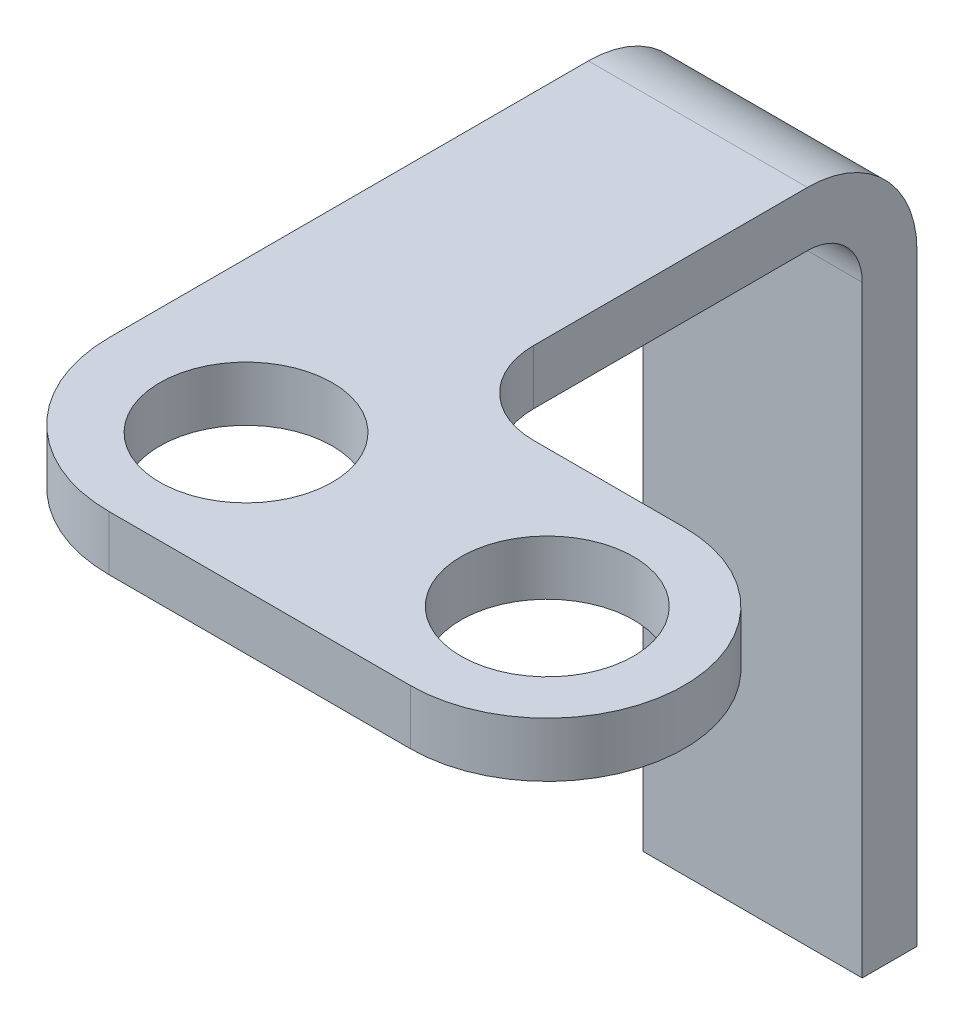
ISO-10303-21;
HEADER;
FILE_DESCRIPTION(('STEP AP214'),'2;1');
FILE_NAME('part.step','',(''),(''),'','','');
FILE_SCHEMA(('AUTOMOTIVE_DESIGN { 1 0 10303 214 1 1 1 1 }'));
ENDSEC;
DATA;
#1=APPLICATION_CONTEXT('core data for automotive mechanical design processes');
#2=APPLICATION_PROTOCOL_DEFINITION('international standard','automotive_design',2000,#1);
#3=PRODUCT_CONTEXT('',#1,'mechanical');
#4=PRODUCT('Part','Part','',(#3));
#5=PRODUCT_RELATED_PRODUCT_CATEGORY('part','',(#4));
#6=PRODUCT_DEFINITION_FORMATION('','',#4);
#7=PRODUCT_DEFINITION_CONTEXT('part definition',#1,'design');
#8=PRODUCT_DEFINITION('design','',#6,#7);
#9=PRODUCT_DEFINITION_SHAPE('','',#8);
#10=(LENGTH_UNIT() NAMED_UNIT(*) SI_UNIT(.MILLI.,.METRE.));
#11=(NAMED_UNIT(*) PLANE_ANGLE_UNIT() SI_UNIT($,.RADIAN.));
#12=(NAMED_UNIT(*) SI_UNIT($,.STERADIAN.) SOLID_ANGLE_UNIT());
#13=UNCERTAINTY_MEASURE_WITH_UNIT(LENGTH_MEASURE(1.E-05),#10,'distance_accuracy_value','');
#14=(GEOMETRIC_REPRESENTATION_CONTEXT(3) GLOBAL_UNCERTAINTY_ASSIGNED_CONTEXT((#13)) GLOBAL_UNIT_ASSIGNED_CONTEXT((#10,
#11,#12)) REPRESENTATION_CONTEXT('',''));
#15=CARTESIAN_POINT('',(0.,0.,0.));
#16=DIRECTION('',(0.,0.,1.));
#17=DIRECTION('',(1.,0.,0.));
#18=AXIS2_PLACEMENT_3D('',#15,#16,#17);
#19=CARTESIAN_POINT('',(8.,-3.,3.));
#20=DIRECTION('',(1.,0.,0.));
#21=DIRECTION('',(0.,0.,-1.));
#22=AXIS2_PLACEMENT_3D('',#19,#20,#21);
#23=PLANE('',#22);
#24=DIRECTION('',(0.,0.,1.));
#25=VECTOR('',#24,1.);
#26=CARTESIAN_POINT('',(8.,1.,3.00000000000002));
#27=LINE('',#26,#25);
#28=CARTESIAN_POINT('',(8.,1.,3.00000000000002));
#29=VERTEX_POINT('',#28);
#30=CARTESIAN_POINT('',(8.,0.999999999999999,13.));
#31=VERTEX_POINT('',#30);
#32=EDGE_CURVE('E139',#29,#31,#27,.T.);
#33=ORIENTED_EDGE('',*,*,#32,.T.);
#34=DIRECTION('',(0.,1.,0.));
#35=VECTOR('',#34,1.);
#36=CARTESIAN_POINT('',(8.,-1.,13.));
#37=LINE('',#36,#35);
#38=CARTESIAN_POINT('',(8.,-1.,13.));
#39=VERTEX_POINT('',#38);
#40=EDGE_CURVE('E127',#39,#31,#37,.T.);
#41=ORIENTED_EDGE('',*,*,#40,.F.);
#42=DIRECTION('',(0.,0.,1.));
#43=VECTOR('',#42,1.);
#44=CARTESIAN_POINT('',(8.,-1.,3.00000000000002));
#45=LINE('',#44,#43);
#46=CARTESIAN_POINT('',(8.,-1.,3.00000000000002));
#47=VERTEX_POINT('',#46);
#48=EDGE_CURVE('E207',#47,#39,#45,.T.);
#49=ORIENTED_EDGE('',*,*,#48,.F.);
#50=CARTESIAN_POINT('',(8.,-3.,3.));
#51=DIRECTION('',(1.,0.,0.));
#52=DIRECTION('',(0.,0.,-1.));
#53=AXIS2_PLACEMENT_3D('',#50,#51,#52);
#54=CIRCLE('',#53,2.);
#55=CARTESIAN_POINT('',(8.,-3.00000000000001,1.));
#56=VERTEX_POINT('',#55);
#57=EDGE_CURVE('E117',#56,#47,#54,.T.);
#58=ORIENTED_EDGE('',*,*,#57,.F.);
#59=DIRECTION('',(0.,1.,0.));
#60=VECTOR('',#59,1.);
#61=CARTESIAN_POINT('',(8.,-25.,1.));
#62=LINE('',#61,#60);
#63=CARTESIAN_POINT('',(8.,-25.,1.));
#64=VERTEX_POINT('',#63);
#65=EDGE_CURVE('E115',#64,#56,#62,.T.);
#66=ORIENTED_EDGE('',*,*,#65,.F.);
#67=DIRECTION('',(0.,0.,1.));
#68=VECTOR('',#67,1.);
#69=CARTESIAN_POINT('',(8.,-25.,-1.));
#70=LINE('',#69,#68);
#71=CARTESIAN_POINT('',(8.,-25.,-1.));
#72=VERTEX_POINT('',#71);
#73=EDGE_CURVE('E103',#72,#64,#70,.T.);
#74=ORIENTED_EDGE('',*,*,#73,.F.);
#75=DIRECTION('',(0.,1.,0.));
#76=VECTOR('',#75,1.);
#77=CARTESIAN_POINT('',(8.,-25.,-1.));
#78=LINE('',#77,#76);
#79=CARTESIAN_POINT('',(8.,-3.00000000000003,-1.));
#80=VERTEX_POINT('',#79);
#81=EDGE_CURVE('E109',#72,#80,#78,.T.);
#82=ORIENTED_EDGE('',*,*,#81,.T.);
#83=CARTESIAN_POINT('',(8.,-3.,3.));
#84=DIRECTION('',(1.,0.,0.));
#85=DIRECTION('',(0.,0.,-1.));
#86=AXIS2_PLACEMENT_3D('',#83,#84,#85);
#87=CIRCLE('',#86,4.);
#88=EDGE_CURVE('E50',#80,#29,#87,.T.);
#89=ORIENTED_EDGE('',*,*,#88,.T.);
#90=EDGE_LOOP('',(#33,#41,#49,#58,#66,#74,#82,#89));
#91=FACE_BOUND('',#90,.T.);
#92=ADVANCED_FACE('F33',(#91),#23,.T.);
#93=CARTESIAN_POINT('',(8.,1.,3.00000000000002));
#94=DIRECTION('',(0.,-1.,0.));
#95=DIRECTION('',(0.,0.,-1.));
#96=AXIS2_PLACEMENT_3D('',#93,#94,#95);
#97=PLANE('',#96);
#98=DIRECTION('',(-1.,0.,0.));
#99=VECTOR('',#98,1.);
#100=CARTESIAN_POINT('',(8.,1.,3.00000000000002));
#101=LINE('',#100,#99);
#102=CARTESIAN_POINT('',(0.,1.,3.00000000000002));
#103=VERTEX_POINT('',#102);
#104=EDGE_CURVE('E122',#29,#103,#101,.T.);
#105=ORIENTED_EDGE('',*,*,#104,.T.);
#106=DIRECTION('',(0.,0.,1.));
#107=VECTOR('',#106,1.);
#108=CARTESIAN_POINT('',(0.,1.,3.00000000000002));
#109=LINE('',#108,#107);
#110=CARTESIAN_POINT('',(0.,0.999999999999998,20.5));
#111=VERTEX_POINT('',#110);
#112=EDGE_CURVE('E123',#103,#111,#109,.T.);
#113=ORIENTED_EDGE('',*,*,#112,.T.);
#114=CARTESIAN_POINT('',(5.5,0.999999999999998,20.5));
#115=DIRECTION('',(0.,1.,0.));
#116=DIRECTION('',(0.,0.,-1.));
#117=AXIS2_PLACEMENT_3D('',#114,#115,#116);
#118=CIRCLE('',#117,5.5);
#119=CARTESIAN_POINT('',(5.5,0.999999999999997,26.));
#120=VERTEX_POINT('',#119);
#121=EDGE_CURVE('E162',#111,#120,#118,.T.);
#122=ORIENTED_EDGE('',*,*,#121,.T.);
#123=DIRECTION('',(1.,0.,0.));
#124=VECTOR('',#123,1.);
#125=CARTESIAN_POINT('',(5.5,0.999999999999997,26.));
#126=LINE('',#125,#124);
#127=CARTESIAN_POINT('',(16.5,0.999999999999997,26.));
#128=VERTEX_POINT('',#127);
#129=EDGE_CURVE('E230',#120,#128,#126,.T.);
#130=ORIENTED_EDGE('',*,*,#129,.T.);
#131=CARTESIAN_POINT('',(16.5,0.999999999999998,21.));
#132=DIRECTION('',(0.,1.,0.));
#133=DIRECTION('',(0.,0.,1.));
#134=AXIS2_PLACEMENT_3D('',#131,#132,#133);
#135=CIRCLE('',#134,5.);
#136=CARTESIAN_POINT('',(16.5,0.999999999999999,16.));
#137=VERTEX_POINT('',#136);
#138=EDGE_CURVE('E227',#128,#137,#135,.T.);
#139=ORIENTED_EDGE('',*,*,#138,.T.);
#140=DIRECTION('',(-1.,0.,0.));
#141=VECTOR('',#140,1.);
#142=CARTESIAN_POINT('',(11.,0.999999999999999,16.));
#143=LINE('',#142,#141);
#144=CARTESIAN_POINT('',(11.,0.999999999999999,16.));
#145=VERTEX_POINT('',#144);
#146=EDGE_CURVE('E225',#137,#145,#143,.T.);
#147=ORIENTED_EDGE('',*,*,#146,.T.);
#148=CARTESIAN_POINT('',(11.,0.999999999999999,13.));
#149=DIRECTION('',(0.,-1.,0.));
#150=DIRECTION('',(0.,0.,-1.));
#151=AXIS2_PLACEMENT_3D('',#148,#149,#150);
#152=CIRCLE('',#151,3.);
#153=EDGE_CURVE('E222',#145,#31,#152,.T.);
#154=ORIENTED_EDGE('',*,*,#153,.T.);
#155=ORIENTED_EDGE('',*,*,#32,.F.);
#156=EDGE_LOOP('',(#105,#113,#122,#130,#139,#147,#154,#155));
#157=FACE_BOUND('',#156,.T.);
#158=CARTESIAN_POINT('',(5.5,0.999999999999998,21.));
#159=DIRECTION('',(0.,1.,0.));
#160=DIRECTION('',(0.,0.,-1.));
#161=AXIS2_PLACEMENT_3D('',#158,#159,#160);
#162=CIRCLE('',#161,3.15);
#163=CARTESIAN_POINT('',(5.5,0.999999999999998,17.85));
#164=VERTEX_POINT('',#163);
#165=EDGE_CURVE('E249',#164,#164,#162,.T.);
#166=ORIENTED_EDGE('',*,*,#165,.F.);
#167=EDGE_LOOP('',(#166));
#168=FACE_BOUND('',#167,.T.);
#169=CARTESIAN_POINT('',(16.5,0.999999999999998,21.));
#170=DIRECTION('',(0.,1.,0.));
#171=DIRECTION('',(0.,0.,1.));
#172=AXIS2_PLACEMENT_3D('',#169,#170,#171);
#173=CIRCLE('',#172,3.15);
#174=CARTESIAN_POINT('',(16.5,0.999999999999997,24.15));
#175=VERTEX_POINT('',#174);
#176=EDGE_CURVE('E243',#175,#175,#173,.T.);
#177=ORIENTED_EDGE('',*,*,#176,.F.);
#178=EDGE_LOOP('',(#177));
#179=FACE_BOUND('',#178,.T.);
#180=ADVANCED_FACE('F35',(#157,#168,#179),#97,.F.);
#181=CARTESIAN_POINT('',(8.,-1.,3.00000000000002));
#182=DIRECTION('',(0.,-1.,0.));
#183=DIRECTION('',(0.,0.,-1.));
#184=AXIS2_PLACEMENT_3D('',#181,#182,#183);
#185=PLANE('',#184);
#186=CARTESIAN_POINT('',(5.5,-1.,21.));
#187=DIRECTION('',(0.,1.,0.));
#188=DIRECTION('',(0.,0.,-1.));
#189=AXIS2_PLACEMENT_3D('',#186,#187,#188);
#190=CIRCLE('',#189,3.15);
#191=CARTESIAN_POINT('',(5.5,-1.,17.85));
#192=VERTEX_POINT('',#191);
#193=EDGE_CURVE('E246',#192,#192,#190,.T.);
#194=ORIENTED_EDGE('',*,*,#193,.T.);
#195=EDGE_LOOP('',(#194));
#196=FACE_BOUND('',#195,.T.);
#197=ORIENTED_EDGE('',*,*,#48,.T.);
#198=CARTESIAN_POINT('',(11.,-1.,13.));
#199=DIRECTION('',(0.,-1.,0.));
#200=DIRECTION('',(0.,0.,-1.));
#201=AXIS2_PLACEMENT_3D('',#198,#199,#200);
#202=CIRCLE('',#201,3.);
#203=CARTESIAN_POINT('',(11.,-1.,16.));
#204=VERTEX_POINT('',#203);
#205=EDGE_CURVE('E202',#204,#39,#202,.T.);
#206=ORIENTED_EDGE('',*,*,#205,.F.);
#207=DIRECTION('',(-1.,0.,0.));
#208=VECTOR('',#207,1.);
#209=CARTESIAN_POINT('',(11.,-1.,16.));
#210=LINE('',#209,#208);
#211=CARTESIAN_POINT('',(16.5,-1.,16.));
#212=VERTEX_POINT('',#211);
#213=EDGE_CURVE('E205',#212,#204,#210,.T.);
#214=ORIENTED_EDGE('',*,*,#213,.F.);
#215=CARTESIAN_POINT('',(16.5,-1.,21.));
#216=DIRECTION('',(0.,1.,0.));
#217=DIRECTION('',(0.,0.,1.));
#218=AXIS2_PLACEMENT_3D('',#215,#216,#217);
#219=CIRCLE('',#218,5.);
#220=CARTESIAN_POINT('',(16.5,-1.,26.));
#221=VERTEX_POINT('',#220);
#222=EDGE_CURVE('E235',#221,#212,#219,.T.);
#223=ORIENTED_EDGE('',*,*,#222,.F.);
#224=DIRECTION('',(1.,0.,0.));
#225=VECTOR('',#224,1.);
#226=CARTESIAN_POINT('',(5.5,-1.,26.));
#227=LINE('',#226,#225);
#228=CARTESIAN_POINT('',(5.5,-1.,26.));
#229=VERTEX_POINT('',#228);
#230=EDGE_CURVE('E238',#229,#221,#227,.T.);
#231=ORIENTED_EDGE('',*,*,#230,.F.);
#232=CARTESIAN_POINT('',(5.5,-1.,20.5));
#233=DIRECTION('',(0.,1.,0.));
#234=DIRECTION('',(0.,0.,-1.));
#235=AXIS2_PLACEMENT_3D('',#232,#233,#234);
#236=CIRCLE('',#235,5.5);
#237=CARTESIAN_POINT('',(0.,-1.,20.5));
#238=VERTEX_POINT('',#237);
#239=EDGE_CURVE('E224',#238,#229,#236,.T.);
#240=ORIENTED_EDGE('',*,*,#239,.F.);
#241=DIRECTION('',(0.,0.,1.));
#242=VECTOR('',#241,1.);
#243=CARTESIAN_POINT('',(0.,-1.,3.00000000000002));
#244=LINE('',#243,#242);
#245=CARTESIAN_POINT('',(0.,-1.,3.00000000000002));
#246=VERTEX_POINT('',#245);
#247=EDGE_CURVE('E126',#246,#238,#244,.T.);
#248=ORIENTED_EDGE('',*,*,#247,.F.);
#249=DIRECTION('',(-1.,0.,0.));
#250=VECTOR('',#249,1.);
#251=CARTESIAN_POINT('',(8.,-1.,3.00000000000002));
#252=LINE('',#251,#250);
#253=EDGE_CURVE('E11',#47,#246,#252,.T.);
#254=ORIENTED_EDGE('',*,*,#253,.F.);
#255=EDGE_LOOP('',(#197,#206,#214,#223,#231,#240,#248,#254));
#256=FACE_BOUND('',#255,.T.);
#257=CARTESIAN_POINT('',(16.5,-1.,21.));
#258=DIRECTION('',(0.,1.,0.));
#259=DIRECTION('',(0.,0.,1.));
#260=AXIS2_PLACEMENT_3D('',#257,#258,#259);
#261=CIRCLE('',#260,3.15);
#262=CARTESIAN_POINT('',(16.5,-1.,24.15));
#263=VERTEX_POINT('',#262);
#264=EDGE_CURVE('E232',#263,#263,#261,.T.);
#265=ORIENTED_EDGE('',*,*,#264,.T.);
#266=EDGE_LOOP('',(#265));
#267=FACE_BOUND('',#266,.T.);
#268=ADVANCED_FACE('F209',(#196,#256,#267),#185,.T.);
#269=CARTESIAN_POINT('',(8.,-3.,3.));
#270=DIRECTION('',(-1.,0.,0.));
#271=DIRECTION('',(0.,0.,1.));
#272=AXIS2_PLACEMENT_3D('',#269,#270,#271);
#273=CYLINDRICAL_SURFACE('',#272,2.);
#274=CARTESIAN_POINT('',(0.,-3.,3.));
#275=DIRECTION('',(1.,0.,0.));
#276=DIRECTION('',(0.,0.,-1.));
#277=AXIS2_PLACEMENT_3D('',#274,#275,#276);
#278=CIRCLE('',#277,2.);
#279=CARTESIAN_POINT('',(0.,-3.00000000000001,1.));
#280=VERTEX_POINT('',#279);
#281=EDGE_CURVE('E130',#280,#246,#278,.T.);
#282=ORIENTED_EDGE('',*,*,#281,.F.);
#283=DIRECTION('',(-1.,0.,0.));
#284=VECTOR('',#283,1.);
#285=CARTESIAN_POINT('',(8.,-3.00000000000001,1.));
#286=LINE('',#285,#284);
#287=EDGE_CURVE('E42',#56,#280,#286,.T.);
#288=ORIENTED_EDGE('',*,*,#287,.F.);
#289=ORIENTED_EDGE('',*,*,#57,.T.);
#290=ORIENTED_EDGE('',*,*,#253,.T.);
#291=EDGE_LOOP('',(#282,#288,#289,#290));
#292=FACE_BOUND('',#291,.T.);
#293=ADVANCED_FACE('F148',(#292),#273,.F.);
#294=CARTESIAN_POINT('',(8.,-25.,1.));
#295=DIRECTION('',(0.,0.,1.));
#296=DIRECTION('',(1.,0.,0.));
#297=AXIS2_PLACEMENT_3D('',#294,#295,#296);
#298=PLANE('',#297);
#299=DIRECTION('',(0.,1.,0.));
#300=VECTOR('',#299,1.);
#301=CARTESIAN_POINT('',(0.,-25.,1.));
#302=LINE('',#301,#300);
#303=CARTESIAN_POINT('',(0.,-25.,1.));
#304=VERTEX_POINT('',#303);
#305=EDGE_CURVE('E133',#304,#280,#302,.T.);
#306=ORIENTED_EDGE('',*,*,#305,.F.);
#307=DIRECTION('',(-1.,0.,0.));
#308=VECTOR('',#307,1.);
#309=CARTESIAN_POINT('',(8.,-25.,1.));
#310=LINE('',#309,#308);
#311=EDGE_CURVE('E106',#64,#304,#310,.T.);
#312=ORIENTED_EDGE('',*,*,#311,.F.);
#313=ORIENTED_EDGE('',*,*,#65,.T.);
#314=ORIENTED_EDGE('',*,*,#287,.T.);
#315=EDGE_LOOP('',(#306,#312,#313,#314));
#316=FACE_BOUND('',#315,.T.);
#317=ADVANCED_FACE('F145',(#316),#298,.T.);
#318=CARTESIAN_POINT('',(8.,-25.,-1.));
#319=DIRECTION('',(0.,-1.,0.));
#320=DIRECTION('',(0.,0.,-1.));
#321=AXIS2_PLACEMENT_3D('',#318,#319,#320);
#322=PLANE('',#321);
#323=DIRECTION('',(0.,0.,1.));
#324=VECTOR('',#323,1.);
#325=CARTESIAN_POINT('',(0.,-25.,-1.));
#326=LINE('',#325,#324);
#327=CARTESIAN_POINT('',(0.,-25.,-1.));
#328=VERTEX_POINT('',#327);
#329=EDGE_CURVE('E105',#328,#304,#326,.T.);
#330=ORIENTED_EDGE('',*,*,#329,.F.);
#331=DIRECTION('',(-1.,0.,0.));
#332=VECTOR('',#331,1.);
#333=CARTESIAN_POINT('',(8.,-25.,-1.));
#334=LINE('',#333,#332);
#335=EDGE_CURVE('E99',#72,#328,#334,.T.);
#336=ORIENTED_EDGE('',*,*,#335,.F.);
#337=ORIENTED_EDGE('',*,*,#73,.T.);
#338=ORIENTED_EDGE('',*,*,#311,.T.);
#339=EDGE_LOOP('',(#330,#336,#337,#338));
#340=FACE_BOUND('',#339,.T.);
#341=ADVANCED_FACE('F101',(#340),#322,.T.);
#342=CARTESIAN_POINT('',(8.,-25.,-1.));
#343=DIRECTION('',(0.,0.,1.));
#344=DIRECTION('',(1.,0.,0.));
#345=AXIS2_PLACEMENT_3D('',#342,#343,#344);
#346=PLANE('',#345);
#347=DIRECTION('',(0.,1.,0.));
#348=VECTOR('',#347,1.);
#349=CARTESIAN_POINT('',(0.,-25.,-1.));
#350=LINE('',#349,#348);
#351=CARTESIAN_POINT('',(0.,-3.00000000000003,-1.));
#352=VERTEX_POINT('',#351);
#353=EDGE_CURVE('E72',#328,#352,#350,.T.);
#354=ORIENTED_EDGE('',*,*,#353,.T.);
#355=DIRECTION('',(-1.,0.,0.));
#356=VECTOR('',#355,1.);
#357=CARTESIAN_POINT('',(8.,-3.00000000000003,-1.));
#358=LINE('',#357,#356);
#359=EDGE_CURVE('E107',#80,#352,#358,.T.);
#360=ORIENTED_EDGE('',*,*,#359,.F.);
#361=ORIENTED_EDGE('',*,*,#81,.F.);
#362=ORIENTED_EDGE('',*,*,#335,.T.);
#363=EDGE_LOOP('',(#354,#360,#361,#362));
#364=FACE_BOUND('',#363,.T.);
#365=ADVANCED_FACE('F110',(#364),#346,.F.);
#366=CARTESIAN_POINT('',(8.,-3.,3.));
#367=DIRECTION('',(-1.,0.,0.));
#368=DIRECTION('',(0.,0.,1.));
#369=AXIS2_PLACEMENT_3D('',#366,#367,#368);
#370=CYLINDRICAL_SURFACE('',#369,4.);
#371=CARTESIAN_POINT('',(0.,-3.,3.));
#372=DIRECTION('',(1.,0.,0.));
#373=DIRECTION('',(0.,0.,-1.));
#374=AXIS2_PLACEMENT_3D('',#371,#372,#373);
#375=CIRCLE('',#374,4.);
#376=EDGE_CURVE('E78',#352,#103,#375,.T.);
#377=ORIENTED_EDGE('',*,*,#376,.T.);
#378=ORIENTED_EDGE('',*,*,#104,.F.);
#379=ORIENTED_EDGE('',*,*,#88,.F.);
#380=ORIENTED_EDGE('',*,*,#359,.T.);
#381=EDGE_LOOP('',(#377,#378,#379,#380));
#382=FACE_BOUND('',#381,.T.);
#383=ADVANCED_FACE('F277',(#382),#370,.T.);
#384=CARTESIAN_POINT('',(0.,-3.,3.));
#385=DIRECTION('',(1.,0.,0.));
#386=DIRECTION('',(0.,0.,-1.));
#387=AXIS2_PLACEMENT_3D('',#384,#385,#386);
#388=PLANE('',#387);
#389=ORIENTED_EDGE('',*,*,#281,.T.);
#390=ORIENTED_EDGE('',*,*,#247,.T.);
#391=DIRECTION('',(0.,1.,0.));
#392=VECTOR('',#391,1.);
#393=CARTESIAN_POINT('',(0.,-1.,20.5));
#394=LINE('',#393,#392);
#395=EDGE_CURVE('E155',#238,#111,#394,.T.);
#396=ORIENTED_EDGE('',*,*,#395,.T.);
#397=ORIENTED_EDGE('',*,*,#112,.F.);
#398=ORIENTED_EDGE('',*,*,#376,.F.);
#399=ORIENTED_EDGE('',*,*,#353,.F.);
#400=ORIENTED_EDGE('',*,*,#329,.T.);
#401=ORIENTED_EDGE('',*,*,#305,.T.);
#402=EDGE_LOOP('',(#389,#390,#396,#397,#398,#399,#400,#401));
#403=FACE_BOUND('',#402,.T.);
#404=ADVANCED_FACE('F150',(#403),#388,.F.);
#405=CARTESIAN_POINT('',(11.,-1.,13.));
#406=DIRECTION('',(0.,1.,0.));
#407=DIRECTION('',(0.,0.,1.));
#408=AXIS2_PLACEMENT_3D('',#405,#406,#407);
#409=CYLINDRICAL_SURFACE('',#408,3.);
#410=ORIENTED_EDGE('',*,*,#153,.F.);
#411=DIRECTION('',(0.,1.,0.));
#412=VECTOR('',#411,1.);
#413=CARTESIAN_POINT('',(11.,-1.,16.));
#414=LINE('',#413,#412);
#415=EDGE_CURVE('E181',#204,#145,#414,.T.);
#416=ORIENTED_EDGE('',*,*,#415,.F.);
#417=ORIENTED_EDGE('',*,*,#205,.T.);
#418=ORIENTED_EDGE('',*,*,#40,.T.);
#419=EDGE_LOOP('',(#410,#416,#417,#418));
#420=FACE_BOUND('',#419,.T.);
#421=ADVANCED_FACE('F203',(#420),#409,.F.);
#422=CARTESIAN_POINT('',(11.,-1.,16.));
#423=DIRECTION('',(0.,0.,-1.));
#424=DIRECTION('',(-1.,0.,0.));
#425=AXIS2_PLACEMENT_3D('',#422,#423,#424);
#426=PLANE('',#425);
#427=ORIENTED_EDGE('',*,*,#146,.F.);
#428=DIRECTION('',(0.,1.,0.));
#429=VECTOR('',#428,1.);
#430=CARTESIAN_POINT('',(16.5,-1.,16.));
#431=LINE('',#430,#429);
#432=EDGE_CURVE('E219',#212,#137,#431,.T.);
#433=ORIENTED_EDGE('',*,*,#432,.F.);
#434=ORIENTED_EDGE('',*,*,#213,.T.);
#435=ORIENTED_EDGE('',*,*,#415,.T.);
#436=EDGE_LOOP('',(#427,#433,#434,#435));
#437=FACE_BOUND('',#436,.T.);
#438=ADVANCED_FACE('F322',(#437),#426,.T.);
#439=CARTESIAN_POINT('',(16.5,-1.,21.));
#440=DIRECTION('',(0.,1.,0.));
#441=DIRECTION('',(0.,0.,1.));
#442=AXIS2_PLACEMENT_3D('',#439,#440,#441);
#443=CYLINDRICAL_SURFACE('',#442,5.);
#444=ORIENTED_EDGE('',*,*,#138,.F.);
#445=DIRECTION('',(0.,1.,0.));
#446=VECTOR('',#445,1.);
#447=CARTESIAN_POINT('',(16.5,-1.,26.));
#448=LINE('',#447,#446);
#449=EDGE_CURVE('E217',#221,#128,#448,.T.);
#450=ORIENTED_EDGE('',*,*,#449,.F.);
#451=ORIENTED_EDGE('',*,*,#222,.T.);
#452=ORIENTED_EDGE('',*,*,#432,.T.);
#453=EDGE_LOOP('',(#444,#450,#451,#452));
#454=FACE_BOUND('',#453,.T.);
#455=ADVANCED_FACE('F329',(#454),#443,.T.);
#456=CARTESIAN_POINT('',(5.5,-1.,26.));
#457=DIRECTION('',(0.,0.,1.));
#458=DIRECTION('',(1.,0.,0.));
#459=AXIS2_PLACEMENT_3D('',#456,#457,#458);
#460=PLANE('',#459);
#461=ORIENTED_EDGE('',*,*,#129,.F.);
#462=DIRECTION('',(0.,1.,0.));
#463=VECTOR('',#462,1.);
#464=CARTESIAN_POINT('',(5.5,-1.,26.));
#465=LINE('',#464,#463);
#466=EDGE_CURVE('E215',#229,#120,#465,.T.);
#467=ORIENTED_EDGE('',*,*,#466,.F.);
#468=ORIENTED_EDGE('',*,*,#230,.T.);
#469=ORIENTED_EDGE('',*,*,#449,.T.);
#470=EDGE_LOOP('',(#461,#467,#468,#469));
#471=FACE_BOUND('',#470,.T.);
#472=ADVANCED_FACE('F336',(#471),#460,.T.);
#473=CARTESIAN_POINT('',(5.5,-1.,20.5));
#474=DIRECTION('',(0.,1.,0.));
#475=DIRECTION('',(0.,0.,1.));
#476=AXIS2_PLACEMENT_3D('',#473,#474,#475);
#477=CYLINDRICAL_SURFACE('',#476,5.5);
#478=ORIENTED_EDGE('',*,*,#121,.F.);
#479=ORIENTED_EDGE('',*,*,#395,.F.);
#480=ORIENTED_EDGE('',*,*,#239,.T.);
#481=ORIENTED_EDGE('',*,*,#466,.T.);
#482=EDGE_LOOP('',(#478,#479,#480,#481));
#483=FACE_BOUND('',#482,.T.);
#484=ADVANCED_FACE('F264',(#483),#477,.T.);
#485=CARTESIAN_POINT('',(16.5,-1.,21.));
#486=DIRECTION('',(0.,1.,0.));
#487=DIRECTION('',(0.,0.,1.));
#488=AXIS2_PLACEMENT_3D('',#485,#486,#487);
#489=CYLINDRICAL_SURFACE('',#488,3.15);
#490=ORIENTED_EDGE('',*,*,#264,.F.);
#491=EDGE_LOOP('',(#490));
#492=FACE_BOUND('',#491,.T.);
#493=ORIENTED_EDGE('',*,*,#176,.T.);
#494=EDGE_LOOP('',(#493));
#495=FACE_BOUND('',#494,.T.);
#496=ADVANCED_FACE('F258',(#492,#495),#489,.F.);
#497=CARTESIAN_POINT('',(5.5,-1.,21.));
#498=DIRECTION('',(0.,1.,0.));
#499=DIRECTION('',(0.,0.,1.));
#500=AXIS2_PLACEMENT_3D('',#497,#498,#499);
#501=CYLINDRICAL_SURFACE('',#500,3.15);
#502=ORIENTED_EDGE('',*,*,#165,.T.);
#503=EDGE_LOOP('',(#502));
#504=FACE_BOUND('',#503,.T.);
#505=ORIENTED_EDGE('',*,*,#193,.F.);
#506=EDGE_LOOP('',(#505));
#507=FACE_BOUND('',#506,.T.);
#508=ADVANCED_FACE('F256',(#504,#507),#501,.F.);
#509=CLOSED_SHELL('',(#92,#180,#268,#293,#317,#341,#365,#383,#404,#421,#438,#455,#472,#484,#496,#508));
#510=MANIFOLD_SOLID_BREP('B2',#509);
#511=ADVANCED_BREP_SHAPE_REPRESENTATION('',(#18,#510),#14);
#512=SHAPE_DEFINITION_REPRESENTATION(#9,#511);
ENDSEC;
END-ISO-10303-21;
